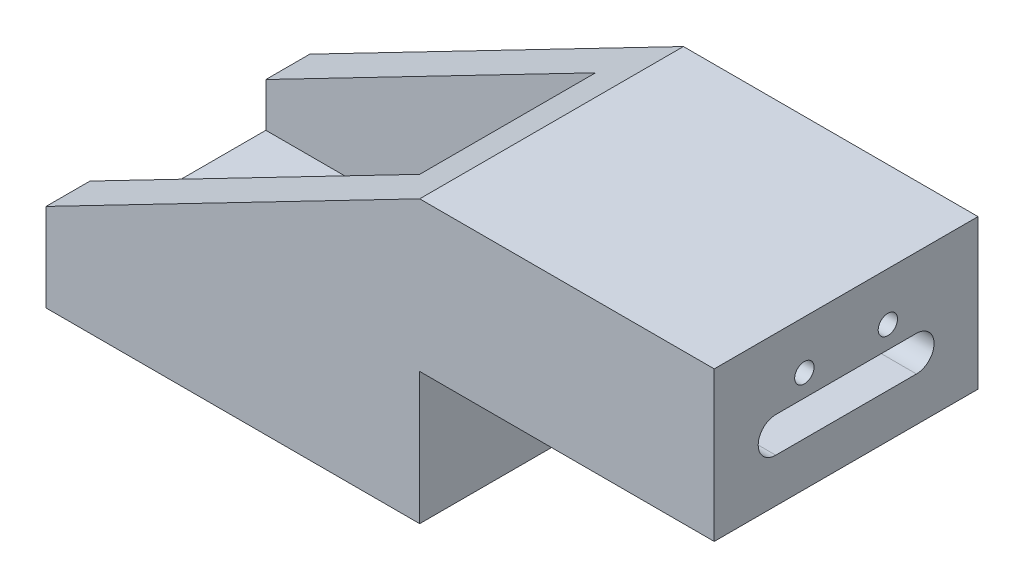
ISO-10303-21;
HEADER;
FILE_DESCRIPTION(('STEP AP214'),'2;1');
FILE_NAME('part.step','',(''),(''),'','','');
FILE_SCHEMA(('AUTOMOTIVE_DESIGN { 1 0 10303 214 1 1 1 1 }'));
ENDSEC;
DATA;
#1=APPLICATION_CONTEXT('core data for automotive mechanical design processes');
#2=APPLICATION_PROTOCOL_DEFINITION('international standard','automotive_design',2000,#1);
#3=PRODUCT_CONTEXT('',#1,'mechanical');
#4=PRODUCT('Part','Part','',(#3));
#5=PRODUCT_RELATED_PRODUCT_CATEGORY('part','',(#4));
#6=PRODUCT_DEFINITION_FORMATION('','',#4);
#7=PRODUCT_DEFINITION_CONTEXT('part definition',#1,'design');
#8=PRODUCT_DEFINITION('design','',#6,#7);
#9=PRODUCT_DEFINITION_SHAPE('','',#8);
#10=(LENGTH_UNIT() NAMED_UNIT(*) SI_UNIT(.MILLI.,.METRE.));
#11=(NAMED_UNIT(*) PLANE_ANGLE_UNIT() SI_UNIT($,.RADIAN.));
#12=(NAMED_UNIT(*) SI_UNIT($,.STERADIAN.) SOLID_ANGLE_UNIT());
#13=UNCERTAINTY_MEASURE_WITH_UNIT(LENGTH_MEASURE(1.E-05),#10,'distance_accuracy_value','');
#14=(GEOMETRIC_REPRESENTATION_CONTEXT(3) GLOBAL_UNCERTAINTY_ASSIGNED_CONTEXT((#13)) GLOBAL_UNIT_ASSIGNED_CONTEXT((#10,
#11,#12)) REPRESENTATION_CONTEXT('',''));
#15=CARTESIAN_POINT('',(0.,0.,0.));
#16=DIRECTION('',(0.,0.,1.));
#17=DIRECTION('',(1.,0.,0.));
#18=AXIS2_PLACEMENT_3D('',#15,#16,#17);
#19=CARTESIAN_POINT('',(20.,32.,0.));
#20=DIRECTION('',(0.,-1.,0.));
#21=DIRECTION('',(1.,0.,0.));
#22=AXIS2_PLACEMENT_3D('',#19,#20,#21);
#23=CYLINDRICAL_SURFACE('',#22,1.55);
#24=CARTESIAN_POINT('',(20.,0.,0.));
#25=DIRECTION('',(0.,1.,0.));
#26=DIRECTION('',(-1.,0.,0.));
#27=AXIS2_PLACEMENT_3D('',#24,#25,#26);
#28=CIRCLE('',#27,1.55);
#29=CARTESIAN_POINT('',(18.45,0.,0.));
#30=VERTEX_POINT('',#29);
#31=EDGE_CURVE('E269',#30,#30,#28,.T.);
#32=ORIENTED_EDGE('',*,*,#31,.F.);
#33=EDGE_LOOP('',(#32));
#34=FACE_BOUND('',#33,.T.);
#35=CARTESIAN_POINT('',(20.,5.,0.));
#36=DIRECTION('',(0.,1.,0.));
#37=DIRECTION('',(-1.,0.,0.));
#38=AXIS2_PLACEMENT_3D('',#35,#36,#37);
#39=CIRCLE('',#38,1.55);
#40=CARTESIAN_POINT('',(18.45,5.,0.));
#41=VERTEX_POINT('',#40);
#42=EDGE_CURVE('E199',#41,#41,#39,.F.);
#43=ORIENTED_EDGE('',*,*,#42,.F.);
#44=EDGE_LOOP('',(#43));
#45=FACE_BOUND('',#44,.T.);
#46=ADVANCED_FACE('F33',(#34,#45),#23,.F.);
#47=CARTESIAN_POINT('',(-10.,10.,15.));
#48=DIRECTION('',(0.459707124982572,-0.888070582352696,0.));
#49=DIRECTION('',(0.888070582352697,0.459707124982573,0.));
#50=AXIS2_PLACEMENT_3D('',#47,#48,#49);
#51=PLANE('',#50);
#52=DIRECTION('',(0.,0.,-1.));
#53=VECTOR('',#52,1.);
#54=CARTESIAN_POINT('',(-10.,10.,15.));
#55=LINE('',#54,#53);
#56=CARTESIAN_POINT('',(-10.,10.,-10.));
#57=VERTEX_POINT('',#56);
#58=CARTESIAN_POINT('',(-10.,10.,-15.));
#59=VERTEX_POINT('',#58);
#60=EDGE_CURVE('E254',#57,#59,#55,.T.);
#61=ORIENTED_EDGE('',*,*,#60,.F.);
#62=DIRECTION('',(-0.888070582352697,-0.459707124982573,0.));
#63=VECTOR('',#62,1.);
#64=CARTESIAN_POINT('',(-10.,9.99999999999999,-10.));
#65=LINE('',#64,#63);
#66=CARTESIAN_POINT('',(27.5,29.4117647058824,-10.));
#67=VERTEX_POINT('',#66);
#68=EDGE_CURVE('E194',#67,#57,#65,.T.);
#69=ORIENTED_EDGE('',*,*,#68,.F.);
#70=DIRECTION('',(0.,0.,-1.));
#71=VECTOR('',#70,1.);
#72=CARTESIAN_POINT('',(27.5,29.4117647058824,15.));
#73=LINE('',#72,#71);
#74=CARTESIAN_POINT('',(27.5,29.4117647058824,10.));
#75=VERTEX_POINT('',#74);
#76=EDGE_CURVE('E188',#75,#67,#73,.T.);
#77=ORIENTED_EDGE('',*,*,#76,.F.);
#78=DIRECTION('',(0.888070582352697,0.459707124982573,0.));
#79=VECTOR('',#78,1.);
#80=CARTESIAN_POINT('',(-10.,10.,10.));
#81=LINE('',#80,#79);
#82=CARTESIAN_POINT('',(-10.,10.,10.));
#83=VERTEX_POINT('',#82);
#84=EDGE_CURVE('E191',#83,#75,#81,.T.);
#85=ORIENTED_EDGE('',*,*,#84,.F.);
#86=CARTESIAN_POINT('',(-10.,10.,15.));
#87=VERTEX_POINT('',#86);
#88=EDGE_CURVE('E255',#87,#83,#55,.T.);
#89=ORIENTED_EDGE('',*,*,#88,.F.);
#90=DIRECTION('',(-0.888070582352696,-0.459707124982572,0.));
#91=VECTOR('',#90,1.);
#92=CARTESIAN_POINT('',(-10.,10.,15.));
#93=LINE('',#92,#91);
#94=CARTESIAN_POINT('',(32.5,32.,15.));
#95=VERTEX_POINT('',#94);
#96=EDGE_CURVE('E231',#95,#87,#93,.T.);
#97=ORIENTED_EDGE('',*,*,#96,.F.);
#98=DIRECTION('',(0.,0.,-1.));
#99=VECTOR('',#98,1.);
#100=CARTESIAN_POINT('',(32.5,32.,15.));
#101=LINE('',#100,#99);
#102=CARTESIAN_POINT('',(32.5,32.,-15.));
#103=VERTEX_POINT('',#102);
#104=EDGE_CURVE('E258',#95,#103,#101,.T.);
#105=ORIENTED_EDGE('',*,*,#104,.T.);
#106=DIRECTION('',(-0.888070582352696,-0.459707124982572,0.));
#107=VECTOR('',#106,1.);
#108=CARTESIAN_POINT('',(-10.,10.,-15.));
#109=LINE('',#108,#107);
#110=EDGE_CURVE('E246',#103,#59,#109,.T.);
#111=ORIENTED_EDGE('',*,*,#110,.T.);
#112=EDGE_LOOP('',(#61,#69,#77,#85,#89,#97,#105,#111));
#113=FACE_BOUND('',#112,.T.);
#114=ADVANCED_FACE('F337',(#113),#51,.F.);
#115=CARTESIAN_POINT('',(-10.,0.,15.));
#116=DIRECTION('',(1.,0.,0.));
#117=DIRECTION('',(0.,0.,-1.));
#118=AXIS2_PLACEMENT_3D('',#115,#116,#117);
#119=PLANE('',#118);
#120=DIRECTION('',(0.,-1.,0.));
#121=VECTOR('',#120,1.);
#122=CARTESIAN_POINT('',(-10.,0.,-10.));
#123=LINE('',#122,#121);
#124=CARTESIAN_POINT('',(-10.,5.,-10.));
#125=VERTEX_POINT('',#124);
#126=EDGE_CURVE('E163',#57,#125,#123,.T.);
#127=ORIENTED_EDGE('',*,*,#126,.F.);
#128=ORIENTED_EDGE('',*,*,#60,.T.);
#129=DIRECTION('',(0.,-1.,0.));
#130=VECTOR('',#129,1.);
#131=CARTESIAN_POINT('',(-10.,0.,-15.));
#132=LINE('',#131,#130);
#133=CARTESIAN_POINT('',(-10.,0.,-15.));
#134=VERTEX_POINT('',#133);
#135=EDGE_CURVE('E249',#59,#134,#132,.T.);
#136=ORIENTED_EDGE('',*,*,#135,.T.);
#137=DIRECTION('',(0.,0.,-1.));
#138=VECTOR('',#137,1.);
#139=CARTESIAN_POINT('',(-10.,0.,15.));
#140=LINE('',#139,#138);
#141=CARTESIAN_POINT('',(-10.,0.,15.));
#142=VERTEX_POINT('',#141);
#143=EDGE_CURVE('E236',#142,#134,#140,.T.);
#144=ORIENTED_EDGE('',*,*,#143,.F.);
#145=DIRECTION('',(0.,-1.,0.));
#146=VECTOR('',#145,1.);
#147=CARTESIAN_POINT('',(-10.,0.,15.));
#148=LINE('',#147,#146);
#149=EDGE_CURVE('E233',#87,#142,#148,.T.);
#150=ORIENTED_EDGE('',*,*,#149,.F.);
#151=ORIENTED_EDGE('',*,*,#88,.T.);
#152=DIRECTION('',(0.,1.,0.));
#153=VECTOR('',#152,1.);
#154=CARTESIAN_POINT('',(-10.,0.,10.));
#155=LINE('',#154,#153);
#156=CARTESIAN_POINT('',(-10.,5.,10.));
#157=VERTEX_POINT('',#156);
#158=EDGE_CURVE('E190',#157,#83,#155,.T.);
#159=ORIENTED_EDGE('',*,*,#158,.F.);
#160=DIRECTION('',(0.,0.,1.));
#161=VECTOR('',#160,1.);
#162=CARTESIAN_POINT('',(-10.,5.,15.));
#163=LINE('',#162,#161);
#164=EDGE_CURVE('E197',#125,#157,#163,.T.);
#165=ORIENTED_EDGE('',*,*,#164,.F.);
#166=EDGE_LOOP('',(#127,#128,#136,#144,#150,#151,#159,#165));
#167=FACE_BOUND('',#166,.T.);
#168=ADVANCED_FACE('F353',(#167),#119,.F.);
#169=CARTESIAN_POINT('',(0.,32.,0.));
#170=DIRECTION('',(0.,-1.,0.));
#171=DIRECTION('',(1.,0.,0.));
#172=AXIS2_PLACEMENT_3D('',#169,#170,#171);
#173=CYLINDRICAL_SURFACE('',#172,4.);
#174=CARTESIAN_POINT('',(0.,0.,0.));
#175=DIRECTION('',(0.,1.,0.));
#176=DIRECTION('',(-1.,0.,0.));
#177=AXIS2_PLACEMENT_3D('',#174,#175,#176);
#178=CIRCLE('',#177,4.);
#179=CARTESIAN_POINT('',(-4.,0.,0.));
#180=VERTEX_POINT('',#179);
#181=EDGE_CURVE('E240',#180,#180,#178,.T.);
#182=ORIENTED_EDGE('',*,*,#181,.F.);
#183=EDGE_LOOP('',(#182));
#184=FACE_BOUND('',#183,.T.);
#185=CARTESIAN_POINT('',(0.,5.,0.));
#186=DIRECTION('',(0.,1.,0.));
#187=DIRECTION('',(-1.,0.,0.));
#188=AXIS2_PLACEMENT_3D('',#185,#186,#187);
#189=CIRCLE('',#188,4.);
#190=CARTESIAN_POINT('',(-4.,5.,0.));
#191=VERTEX_POINT('',#190);
#192=EDGE_CURVE('E37',#191,#191,#189,.F.);
#193=ORIENTED_EDGE('',*,*,#192,.F.);
#194=EDGE_LOOP('',(#193));
#195=FACE_BOUND('',#194,.T.);
#196=ADVANCED_FACE('F377',(#184,#195),#173,.F.);
#197=CARTESIAN_POINT('',(-9.99999999999999,22.0000000000001,-8.));
#198=DIRECTION('',(1.,0.,0.));
#199=DIRECTION('',(0.,1.,0.));
#200=AXIS2_PLACEMENT_3D('',#197,#198,#199);
#201=CYLINDRICAL_SURFACE('',#200,2.);
#202=CARTESIAN_POINT('',(27.5,22.,-8.));
#203=DIRECTION('',(-1.,0.,0.));
#204=DIRECTION('',(0.,0.,1.));
#205=AXIS2_PLACEMENT_3D('',#202,#203,#204);
#206=CIRCLE('',#205,2.);
#207=CARTESIAN_POINT('',(27.5,22.0000000000001,-10.));
#208=VERTEX_POINT('',#207);
#209=CARTESIAN_POINT('',(27.5,24.,-8.));
#210=VERTEX_POINT('',#209);
#211=EDGE_CURVE('E58',#208,#210,#206,.F.);
#212=ORIENTED_EDGE('',*,*,#211,.F.);
#213=CARTESIAN_POINT('',(27.5,20.,-7.99999999999999));
#214=VERTEX_POINT('',#213);
#215=EDGE_CURVE('E155',#214,#208,#206,.F.);
#216=ORIENTED_EDGE('',*,*,#215,.F.);
#217=DIRECTION('',(1.,0.,0.));
#218=VECTOR('',#217,1.);
#219=CARTESIAN_POINT('',(-10.,20.0000000000001,-8.));
#220=LINE('',#219,#218);
#221=CARTESIAN_POINT('',(66.,20.,-8.));
#222=VERTEX_POINT('',#221);
#223=EDGE_CURVE('E205',#214,#222,#220,.T.);
#224=ORIENTED_EDGE('',*,*,#223,.T.);
#225=CARTESIAN_POINT('',(66.,22.,-8.));
#226=DIRECTION('',(1.,0.,0.));
#227=DIRECTION('',(0.,1.,0.));
#228=AXIS2_PLACEMENT_3D('',#225,#226,#227);
#229=CIRCLE('',#228,2.);
#230=CARTESIAN_POINT('',(66.,24.,-8.));
#231=VERTEX_POINT('',#230);
#232=EDGE_CURVE('E272',#222,#231,#229,.T.);
#233=ORIENTED_EDGE('',*,*,#232,.T.);
#234=DIRECTION('',(1.,0.,0.));
#235=VECTOR('',#234,1.);
#236=CARTESIAN_POINT('',(-9.99999999999999,24.0000000000001,-8.));
#237=LINE('',#236,#235);
#238=EDGE_CURVE('E202',#210,#231,#237,.T.);
#239=ORIENTED_EDGE('',*,*,#238,.F.);
#240=EDGE_LOOP('',(#212,#216,#224,#233,#239));
#241=FACE_BOUND('',#240,.T.);
#242=ADVANCED_FACE('F291',(#241),#201,.F.);
#243=CARTESIAN_POINT('',(-9.99999999999999,22.0000000000001,8.));
#244=DIRECTION('',(1.,0.,0.));
#245=DIRECTION('',(0.,1.,0.));
#246=AXIS2_PLACEMENT_3D('',#243,#244,#245);
#247=CYLINDRICAL_SURFACE('',#246,2.);
#248=CARTESIAN_POINT('',(27.5,22.,8.));
#249=DIRECTION('',(-1.,0.,0.));
#250=DIRECTION('',(0.,0.,1.));
#251=AXIS2_PLACEMENT_3D('',#248,#249,#250);
#252=CIRCLE('',#251,2.);
#253=CARTESIAN_POINT('',(27.5,22.0000000000001,10.));
#254=VERTEX_POINT('',#253);
#255=CARTESIAN_POINT('',(27.5,20.,8.));
#256=VERTEX_POINT('',#255);
#257=EDGE_CURVE('E184',#254,#256,#252,.F.);
#258=ORIENTED_EDGE('',*,*,#257,.F.);
#259=CARTESIAN_POINT('',(27.5,24.,8.));
#260=VERTEX_POINT('',#259);
#261=EDGE_CURVE('E182',#260,#254,#252,.F.);
#262=ORIENTED_EDGE('',*,*,#261,.F.);
#263=DIRECTION('',(1.,0.,0.));
#264=VECTOR('',#263,1.);
#265=CARTESIAN_POINT('',(-9.99999999999999,24.0000000000001,8.));
#266=LINE('',#265,#264);
#267=CARTESIAN_POINT('',(66.,24.,8.));
#268=VERTEX_POINT('',#267);
#269=EDGE_CURVE('E206',#260,#268,#266,.T.);
#270=ORIENTED_EDGE('',*,*,#269,.T.);
#271=CARTESIAN_POINT('',(66.,22.,8.));
#272=DIRECTION('',(1.,0.,0.));
#273=DIRECTION('',(0.,1.,0.));
#274=AXIS2_PLACEMENT_3D('',#271,#272,#273);
#275=CIRCLE('',#274,2.);
#276=CARTESIAN_POINT('',(66.,20.,8.));
#277=VERTEX_POINT('',#276);
#278=EDGE_CURVE('E218',#268,#277,#275,.T.);
#279=ORIENTED_EDGE('',*,*,#278,.T.);
#280=DIRECTION('',(1.,0.,0.));
#281=VECTOR('',#280,1.);
#282=CARTESIAN_POINT('',(-9.99999999999999,20.0000000000001,8.));
#283=LINE('',#282,#281);
#284=EDGE_CURVE('E203',#256,#277,#283,.T.);
#285=ORIENTED_EDGE('',*,*,#284,.F.);
#286=EDGE_LOOP('',(#258,#262,#270,#279,#285));
#287=FACE_BOUND('',#286,.T.);
#288=ADVANCED_FACE('F302',(#287),#247,.F.);
#289=CARTESIAN_POINT('',(-10.,20.0000000000001,8.));
#290=DIRECTION('',(0.,-1.,0.));
#291=DIRECTION('',(1.,0.,0.));
#292=AXIS2_PLACEMENT_3D('',#289,#290,#291);
#293=PLANE('',#292);
#294=DIRECTION('',(0.,0.,-1.));
#295=VECTOR('',#294,1.);
#296=CARTESIAN_POINT('',(27.5,20.,7.99999999999998));
#297=LINE('',#296,#295);
#298=EDGE_CURVE('E186',#256,#214,#297,.T.);
#299=ORIENTED_EDGE('',*,*,#298,.F.);
#300=ORIENTED_EDGE('',*,*,#284,.T.);
#301=DIRECTION('',(0.,0.,1.));
#302=VECTOR('',#301,1.);
#303=CARTESIAN_POINT('',(66.,20.,8.));
#304=LINE('',#303,#302);
#305=EDGE_CURVE('E215',#277,#222,#304,.F.);
#306=ORIENTED_EDGE('',*,*,#305,.T.);
#307=ORIENTED_EDGE('',*,*,#223,.F.);
#308=EDGE_LOOP('',(#299,#300,#306,#307));
#309=FACE_BOUND('',#308,.T.);
#310=ADVANCED_FACE('F307',(#309),#293,.F.);
#311=CARTESIAN_POINT('',(-9.99999999999999,24.0000000000001,8.));
#312=DIRECTION('',(0.,1.,0.));
#313=DIRECTION('',(-1.,0.,0.));
#314=AXIS2_PLACEMENT_3D('',#311,#312,#313);
#315=PLANE('',#314);
#316=DIRECTION('',(0.,0.,1.));
#317=VECTOR('',#316,1.);
#318=CARTESIAN_POINT('',(27.5,24.,7.99999999999998));
#319=LINE('',#318,#317);
#320=EDGE_CURVE('E179',#210,#260,#319,.T.);
#321=ORIENTED_EDGE('',*,*,#320,.F.);
#322=ORIENTED_EDGE('',*,*,#238,.T.);
#323=DIRECTION('',(0.,0.,1.));
#324=VECTOR('',#323,1.);
#325=CARTESIAN_POINT('',(66.,24.,8.));
#326=LINE('',#325,#324);
#327=EDGE_CURVE('E208',#231,#268,#326,.T.);
#328=ORIENTED_EDGE('',*,*,#327,.T.);
#329=ORIENTED_EDGE('',*,*,#269,.F.);
#330=EDGE_LOOP('',(#321,#322,#328,#329));
#331=FACE_BOUND('',#330,.T.);
#332=ADVANCED_FACE('F296',(#331),#315,.F.);
#333=CARTESIAN_POINT('',(-9.99999999999999,26.5000000000003,4.75));
#334=DIRECTION('',(1.,0.,0.));
#335=DIRECTION('',(0.,1.,0.));
#336=AXIS2_PLACEMENT_3D('',#333,#334,#335);
#337=CYLINDRICAL_SURFACE('',#336,1.1);
#338=CARTESIAN_POINT('',(66.,26.5000000000003,4.75));
#339=DIRECTION('',(-1.,0.,0.));
#340=DIRECTION('',(0.,-1.,0.));
#341=AXIS2_PLACEMENT_3D('',#338,#339,#340);
#342=CIRCLE('',#341,1.1);
#343=CARTESIAN_POINT('',(66.,25.4000000000003,4.75));
#344=VERTEX_POINT('',#343);
#345=EDGE_CURVE('E211',#344,#344,#342,.T.);
#346=ORIENTED_EDGE('',*,*,#345,.F.);
#347=EDGE_LOOP('',(#346));
#348=FACE_BOUND('',#347,.T.);
#349=CARTESIAN_POINT('',(27.5,26.5000000000003,4.75));
#350=DIRECTION('',(-1.,0.,0.));
#351=DIRECTION('',(0.,0.,1.));
#352=AXIS2_PLACEMENT_3D('',#349,#350,#351);
#353=CIRCLE('',#352,1.1);
#354=CARTESIAN_POINT('',(27.5,26.5000000000003,5.85));
#355=VERTEX_POINT('',#354);
#356=EDGE_CURVE('E176',#355,#355,#353,.F.);
#357=ORIENTED_EDGE('',*,*,#356,.F.);
#358=EDGE_LOOP('',(#357));
#359=FACE_BOUND('',#358,.T.);
#360=ADVANCED_FACE('F397',(#348,#359),#337,.F.);
#361=CARTESIAN_POINT('',(-9.99999999999999,26.5000000000003,-4.75));
#362=DIRECTION('',(1.,0.,0.));
#363=DIRECTION('',(0.,1.,0.));
#364=AXIS2_PLACEMENT_3D('',#361,#362,#363);
#365=CYLINDRICAL_SURFACE('',#364,1.1);
#366=CARTESIAN_POINT('',(66.,26.5000000000003,-4.75));
#367=DIRECTION('',(-1.,0.,0.));
#368=DIRECTION('',(0.,-1.,0.));
#369=AXIS2_PLACEMENT_3D('',#366,#367,#368);
#370=CIRCLE('',#369,1.1);
#371=CARTESIAN_POINT('',(66.,25.4000000000003,-4.75));
#372=VERTEX_POINT('',#371);
#373=EDGE_CURVE('E214',#372,#372,#370,.T.);
#374=ORIENTED_EDGE('',*,*,#373,.F.);
#375=EDGE_LOOP('',(#374));
#376=FACE_BOUND('',#375,.T.);
#377=CARTESIAN_POINT('',(27.5,26.5000000000003,-4.75));
#378=DIRECTION('',(-1.,0.,0.));
#379=DIRECTION('',(0.,0.,1.));
#380=AXIS2_PLACEMENT_3D('',#377,#378,#379);
#381=CIRCLE('',#380,1.1);
#382=CARTESIAN_POINT('',(27.5,26.5000000000003,-3.65));
#383=VERTEX_POINT('',#382);
#384=EDGE_CURVE('E180',#383,#383,#381,.F.);
#385=ORIENTED_EDGE('',*,*,#384,.F.);
#386=EDGE_LOOP('',(#385));
#387=FACE_BOUND('',#386,.T.);
#388=ADVANCED_FACE('F393',(#376,#387),#365,.F.);
#389=CARTESIAN_POINT('',(32.5,15.,15.));
#390=DIRECTION('',(-1.,0.,0.));
#391=DIRECTION('',(0.,0.,1.));
#392=AXIS2_PLACEMENT_3D('',#389,#390,#391);
#393=PLANE('',#392);
#394=DIRECTION('',(0.,1.,0.));
#395=VECTOR('',#394,1.);
#396=CARTESIAN_POINT('',(32.5,15.,-15.));
#397=LINE('',#396,#395);
#398=CARTESIAN_POINT('',(32.5,0.,-15.));
#399=VERTEX_POINT('',#398);
#400=CARTESIAN_POINT('',(32.5,15.,-15.));
#401=VERTEX_POINT('',#400);
#402=EDGE_CURVE('E237',#399,#401,#397,.T.);
#403=ORIENTED_EDGE('',*,*,#402,.T.);
#404=DIRECTION('',(0.,0.,-1.));
#405=VECTOR('',#404,1.);
#406=CARTESIAN_POINT('',(32.5,15.,15.));
#407=LINE('',#406,#405);
#408=CARTESIAN_POINT('',(32.5,15.,15.));
#409=VERTEX_POINT('',#408);
#410=EDGE_CURVE('E42',#409,#401,#407,.T.);
#411=ORIENTED_EDGE('',*,*,#410,.F.);
#412=DIRECTION('',(0.,1.,0.));
#413=VECTOR('',#412,1.);
#414=CARTESIAN_POINT('',(32.5,15.,15.));
#415=LINE('',#414,#413);
#416=CARTESIAN_POINT('',(32.5,0.,15.));
#417=VERTEX_POINT('',#416);
#418=EDGE_CURVE('E222',#417,#409,#415,.T.);
#419=ORIENTED_EDGE('',*,*,#418,.F.);
#420=DIRECTION('',(0.,0.,-1.));
#421=VECTOR('',#420,1.);
#422=CARTESIAN_POINT('',(32.5,0.,15.));
#423=LINE('',#422,#421);
#424=EDGE_CURVE('E11',#417,#399,#423,.T.);
#425=ORIENTED_EDGE('',*,*,#424,.T.);
#426=EDGE_LOOP('',(#403,#411,#419,#425));
#427=FACE_BOUND('',#426,.T.);
#428=ADVANCED_FACE('F35',(#427),#393,.F.);
#429=CARTESIAN_POINT('',(66.,15.,15.));
#430=DIRECTION('',(0.,1.,0.));
#431=DIRECTION('',(-1.,0.,0.));
#432=AXIS2_PLACEMENT_3D('',#429,#430,#431);
#433=PLANE('',#432);
#434=DIRECTION('',(1.,0.,0.));
#435=VECTOR('',#434,1.);
#436=CARTESIAN_POINT('',(66.,15.,-15.));
#437=LINE('',#436,#435);
#438=CARTESIAN_POINT('',(66.,15.,-15.));
#439=VERTEX_POINT('',#438);
#440=EDGE_CURVE('E239',#401,#439,#437,.T.);
#441=ORIENTED_EDGE('',*,*,#440,.T.);
#442=DIRECTION('',(0.,0.,-1.));
#443=VECTOR('',#442,1.);
#444=CARTESIAN_POINT('',(66.,15.,15.));
#445=LINE('',#444,#443);
#446=CARTESIAN_POINT('',(66.,15.,15.));
#447=VERTEX_POINT('',#446);
#448=EDGE_CURVE('E264',#447,#439,#445,.T.);
#449=ORIENTED_EDGE('',*,*,#448,.F.);
#450=DIRECTION('',(1.,0.,0.));
#451=VECTOR('',#450,1.);
#452=CARTESIAN_POINT('',(66.,15.,15.));
#453=LINE('',#452,#451);
#454=EDGE_CURVE('E225',#409,#447,#453,.T.);
#455=ORIENTED_EDGE('',*,*,#454,.F.);
#456=ORIENTED_EDGE('',*,*,#410,.T.);
#457=EDGE_LOOP('',(#441,#449,#455,#456));
#458=FACE_BOUND('',#457,.T.);
#459=ADVANCED_FACE('F314',(#458),#433,.F.);
#460=CARTESIAN_POINT('',(66.,32.,15.));
#461=DIRECTION('',(-1.,0.,0.));
#462=DIRECTION('',(0.,-1.,0.));
#463=AXIS2_PLACEMENT_3D('',#460,#461,#462);
#464=PLANE('',#463);
#465=ORIENTED_EDGE('',*,*,#327,.F.);
#466=ORIENTED_EDGE('',*,*,#232,.F.);
#467=ORIENTED_EDGE('',*,*,#305,.F.);
#468=ORIENTED_EDGE('',*,*,#278,.F.);
#469=EDGE_LOOP('',(#465,#466,#467,#468));
#470=FACE_BOUND('',#469,.T.);
#471=ORIENTED_EDGE('',*,*,#373,.T.);
#472=EDGE_LOOP('',(#471));
#473=FACE_BOUND('',#472,.T.);
#474=ORIENTED_EDGE('',*,*,#345,.T.);
#475=EDGE_LOOP('',(#474));
#476=FACE_BOUND('',#475,.T.);
#477=DIRECTION('',(0.,1.,0.));
#478=VECTOR('',#477,1.);
#479=CARTESIAN_POINT('',(66.,32.,-15.));
#480=LINE('',#479,#478);
#481=CARTESIAN_POINT('',(66.,32.,-15.));
#482=VERTEX_POINT('',#481);
#483=EDGE_CURVE('E242',#439,#482,#480,.T.);
#484=ORIENTED_EDGE('',*,*,#483,.T.);
#485=DIRECTION('',(0.,0.,-1.));
#486=VECTOR('',#485,1.);
#487=CARTESIAN_POINT('',(66.,32.,15.));
#488=LINE('',#487,#486);
#489=CARTESIAN_POINT('',(66.,32.,15.));
#490=VERTEX_POINT('',#489);
#491=EDGE_CURVE('E261',#490,#482,#488,.T.);
#492=ORIENTED_EDGE('',*,*,#491,.F.);
#493=DIRECTION('',(0.,1.,0.));
#494=VECTOR('',#493,1.);
#495=CARTESIAN_POINT('',(66.,32.,15.));
#496=LINE('',#495,#494);
#497=EDGE_CURVE('E227',#447,#490,#496,.T.);
#498=ORIENTED_EDGE('',*,*,#497,.F.);
#499=ORIENTED_EDGE('',*,*,#448,.T.);
#500=EDGE_LOOP('',(#484,#492,#498,#499));
#501=FACE_BOUND('',#500,.T.);
#502=ADVANCED_FACE('F310',(#470,#473,#476,#501),#464,.F.);
#503=CARTESIAN_POINT('',(32.5,32.,15.));
#504=DIRECTION('',(0.,-1.,0.));
#505=DIRECTION('',(0.,0.,-1.));
#506=AXIS2_PLACEMENT_3D('',#503,#504,#505);
#507=PLANE('',#506);
#508=DIRECTION('',(-1.,0.,0.));
#509=VECTOR('',#508,1.);
#510=CARTESIAN_POINT('',(32.5,32.,-15.));
#511=LINE('',#510,#509);
#512=EDGE_CURVE('E244',#482,#103,#511,.T.);
#513=ORIENTED_EDGE('',*,*,#512,.T.);
#514=ORIENTED_EDGE('',*,*,#104,.F.);
#515=DIRECTION('',(-1.,0.,0.));
#516=VECTOR('',#515,1.);
#517=CARTESIAN_POINT('',(32.5,32.,15.));
#518=LINE('',#517,#516);
#519=EDGE_CURVE('E229',#490,#95,#518,.T.);
#520=ORIENTED_EDGE('',*,*,#519,.F.);
#521=ORIENTED_EDGE('',*,*,#491,.T.);
#522=EDGE_LOOP('',(#513,#514,#520,#521));
#523=FACE_BOUND('',#522,.T.);
#524=ADVANCED_FACE('F313',(#523),#507,.F.);
#525=CARTESIAN_POINT('',(0.,0.,15.));
#526=DIRECTION('',(0.,1.,0.));
#527=DIRECTION('',(-1.,0.,0.));
#528=AXIS2_PLACEMENT_3D('',#525,#526,#527);
#529=PLANE('',#528);
#530=ORIENTED_EDGE('',*,*,#181,.T.);
#531=EDGE_LOOP('',(#530));
#532=FACE_BOUND('',#531,.T.);
#533=ORIENTED_EDGE('',*,*,#31,.T.);
#534=EDGE_LOOP('',(#533));
#535=FACE_BOUND('',#534,.T.);
#536=DIRECTION('',(1.,0.,0.));
#537=VECTOR('',#536,1.);
#538=CARTESIAN_POINT('',(0.,0.,-15.));
#539=LINE('',#538,#537);
#540=EDGE_CURVE('E223',#134,#399,#539,.T.);
#541=ORIENTED_EDGE('',*,*,#540,.T.);
#542=ORIENTED_EDGE('',*,*,#424,.F.);
#543=DIRECTION('',(1.,0.,0.));
#544=VECTOR('',#543,1.);
#545=CARTESIAN_POINT('',(32.5,0.,15.));
#546=LINE('',#545,#544);
#547=EDGE_CURVE('E219',#142,#417,#546,.T.);
#548=ORIENTED_EDGE('',*,*,#547,.F.);
#549=ORIENTED_EDGE('',*,*,#143,.T.);
#550=EDGE_LOOP('',(#541,#542,#548,#549));
#551=FACE_BOUND('',#550,.T.);
#552=ADVANCED_FACE('F351',(#532,#535,#551),#529,.F.);
#553=CARTESIAN_POINT('',(0.,0.,15.));
#554=DIRECTION('',(0.,0.,-1.));
#555=DIRECTION('',(-1.,0.,0.));
#556=AXIS2_PLACEMENT_3D('',#553,#554,#555);
#557=PLANE('',#556);
#558=ORIENTED_EDGE('',*,*,#547,.T.);
#559=ORIENTED_EDGE('',*,*,#418,.T.);
#560=ORIENTED_EDGE('',*,*,#454,.T.);
#561=ORIENTED_EDGE('',*,*,#497,.T.);
#562=ORIENTED_EDGE('',*,*,#519,.T.);
#563=ORIENTED_EDGE('',*,*,#96,.T.);
#564=ORIENTED_EDGE('',*,*,#149,.T.);
#565=EDGE_LOOP('',(#558,#559,#560,#561,#562,#563,#564));
#566=FACE_BOUND('',#565,.T.);
#567=ADVANCED_FACE('F343',(#566),#557,.F.);
#568=CARTESIAN_POINT('',(0.,0.,-15.));
#569=DIRECTION('',(0.,0.,-1.));
#570=DIRECTION('',(-1.,0.,0.));
#571=AXIS2_PLACEMENT_3D('',#568,#569,#570);
#572=PLANE('',#571);
#573=ORIENTED_EDGE('',*,*,#402,.F.);
#574=ORIENTED_EDGE('',*,*,#540,.F.);
#575=ORIENTED_EDGE('',*,*,#135,.F.);
#576=ORIENTED_EDGE('',*,*,#110,.F.);
#577=ORIENTED_EDGE('',*,*,#512,.F.);
#578=ORIENTED_EDGE('',*,*,#483,.F.);
#579=ORIENTED_EDGE('',*,*,#440,.F.);
#580=EDGE_LOOP('',(#573,#574,#575,#576,#577,#578,#579));
#581=FACE_BOUND('',#580,.T.);
#582=ADVANCED_FACE('F332',(#581),#572,.T.);
#583=CARTESIAN_POINT('',(0.,5.,0.));
#584=DIRECTION('',(0.,1.,0.));
#585=DIRECTION('',(-1.,0.,0.));
#586=AXIS2_PLACEMENT_3D('',#583,#584,#585);
#587=PLANE('',#586);
#588=ORIENTED_EDGE('',*,*,#192,.T.);
#589=EDGE_LOOP('',(#588));
#590=FACE_BOUND('',#589,.T.);
#591=ORIENTED_EDGE('',*,*,#164,.T.);
#592=DIRECTION('',(1.,0.,0.));
#593=VECTOR('',#592,1.);
#594=CARTESIAN_POINT('',(-15.,5.,10.));
#595=LINE('',#594,#593);
#596=CARTESIAN_POINT('',(27.5,5.,10.));
#597=VERTEX_POINT('',#596);
#598=EDGE_CURVE('E165',#157,#597,#595,.T.);
#599=ORIENTED_EDGE('',*,*,#598,.T.);
#600=DIRECTION('',(0.,0.,-1.));
#601=VECTOR('',#600,1.);
#602=CARTESIAN_POINT('',(27.5,5.,-10.));
#603=LINE('',#602,#601);
#604=CARTESIAN_POINT('',(27.5,5.,-10.));
#605=VERTEX_POINT('',#604);
#606=EDGE_CURVE('E153',#597,#605,#603,.T.);
#607=ORIENTED_EDGE('',*,*,#606,.T.);
#608=DIRECTION('',(-1.,0.,0.));
#609=VECTOR('',#608,1.);
#610=CARTESIAN_POINT('',(27.5,5.,-10.));
#611=LINE('',#610,#609);
#612=EDGE_CURVE('E50',#605,#125,#611,.T.);
#613=ORIENTED_EDGE('',*,*,#612,.T.);
#614=EDGE_LOOP('',(#591,#599,#607,#613));
#615=FACE_BOUND('',#614,.T.);
#616=ORIENTED_EDGE('',*,*,#42,.T.);
#617=EDGE_LOOP('',(#616));
#618=FACE_BOUND('',#617,.T.);
#619=ADVANCED_FACE('F167',(#590,#615,#618),#587,.T.);
#620=CARTESIAN_POINT('',(27.5,32.,-10.));
#621=DIRECTION('',(0.,0.,1.));
#622=DIRECTION('',(1.,0.,0.));
#623=AXIS2_PLACEMENT_3D('',#620,#621,#622);
#624=PLANE('',#623);
#625=ORIENTED_EDGE('',*,*,#68,.T.);
#626=ORIENTED_EDGE('',*,*,#126,.T.);
#627=ORIENTED_EDGE('',*,*,#612,.F.);
#628=DIRECTION('',(0.,-1.,0.));
#629=VECTOR('',#628,1.);
#630=CARTESIAN_POINT('',(27.5,32.,-10.));
#631=LINE('',#630,#629);
#632=EDGE_CURVE('E150',#208,#605,#631,.T.);
#633=ORIENTED_EDGE('',*,*,#632,.F.);
#634=EDGE_CURVE('E158',#67,#208,#631,.T.);
#635=ORIENTED_EDGE('',*,*,#634,.F.);
#636=EDGE_LOOP('',(#625,#626,#627,#633,#635));
#637=FACE_BOUND('',#636,.T.);
#638=ADVANCED_FACE('F161',(#637),#624,.T.);
#639=CARTESIAN_POINT('',(-15.,32.,10.));
#640=DIRECTION('',(0.,0.,-1.));
#641=DIRECTION('',(-1.,0.,0.));
#642=AXIS2_PLACEMENT_3D('',#639,#640,#641);
#643=PLANE('',#642);
#644=ORIENTED_EDGE('',*,*,#84,.T.);
#645=DIRECTION('',(0.,-1.,0.));
#646=VECTOR('',#645,1.);
#647=CARTESIAN_POINT('',(27.5,32.,10.));
#648=LINE('',#647,#646);
#649=EDGE_CURVE('E159',#75,#254,#648,.T.);
#650=ORIENTED_EDGE('',*,*,#649,.T.);
#651=EDGE_CURVE('E174',#254,#597,#648,.T.);
#652=ORIENTED_EDGE('',*,*,#651,.T.);
#653=ORIENTED_EDGE('',*,*,#598,.F.);
#654=ORIENTED_EDGE('',*,*,#158,.T.);
#655=EDGE_LOOP('',(#644,#650,#652,#653,#654));
#656=FACE_BOUND('',#655,.T.);
#657=ADVANCED_FACE('F356',(#656),#643,.T.);
#658=CARTESIAN_POINT('',(27.5,32.,-10.));
#659=DIRECTION('',(-1.,0.,0.));
#660=DIRECTION('',(0.,0.,1.));
#661=AXIS2_PLACEMENT_3D('',#658,#659,#660);
#662=PLANE('',#661);
#663=ORIENTED_EDGE('',*,*,#384,.T.);
#664=EDGE_LOOP('',(#663));
#665=FACE_BOUND('',#664,.T.);
#666=ORIENTED_EDGE('',*,*,#356,.T.);
#667=EDGE_LOOP('',(#666));
#668=FACE_BOUND('',#667,.T.);
#669=ORIENTED_EDGE('',*,*,#76,.T.);
#670=ORIENTED_EDGE('',*,*,#634,.T.);
#671=ORIENTED_EDGE('',*,*,#211,.T.);
#672=ORIENTED_EDGE('',*,*,#320,.T.);
#673=ORIENTED_EDGE('',*,*,#261,.T.);
#674=ORIENTED_EDGE('',*,*,#649,.F.);
#675=EDGE_LOOP('',(#669,#670,#671,#672,#673,#674));
#676=FACE_BOUND('',#675,.T.);
#677=ADVANCED_FACE('F285',(#665,#668,#676),#662,.T.);
#678=ORIENTED_EDGE('',*,*,#215,.T.);
#679=ORIENTED_EDGE('',*,*,#632,.T.);
#680=ORIENTED_EDGE('',*,*,#606,.F.);
#681=ORIENTED_EDGE('',*,*,#651,.F.);
#682=ORIENTED_EDGE('',*,*,#257,.T.);
#683=ORIENTED_EDGE('',*,*,#298,.T.);
#684=EDGE_LOOP('',(#678,#679,#680,#681,#682,#683));
#685=FACE_BOUND('',#684,.T.);
#686=ADVANCED_FACE('F151',(#685),#662,.T.);
#687=CLOSED_SHELL('',(#46,#114,#168,#196,#242,#288,#310,#332,#360,#388,#428,#459,#502,#524,#552,
#567,#582,#619,#638,#657,#677,#686));
#688=MANIFOLD_SOLID_BREP('B2',#687);
#689=ADVANCED_BREP_SHAPE_REPRESENTATION('',(#18,#688),#14);
#690=SHAPE_DEFINITION_REPRESENTATION(#9,#689);
ENDSEC;
END-ISO-10303-21;
